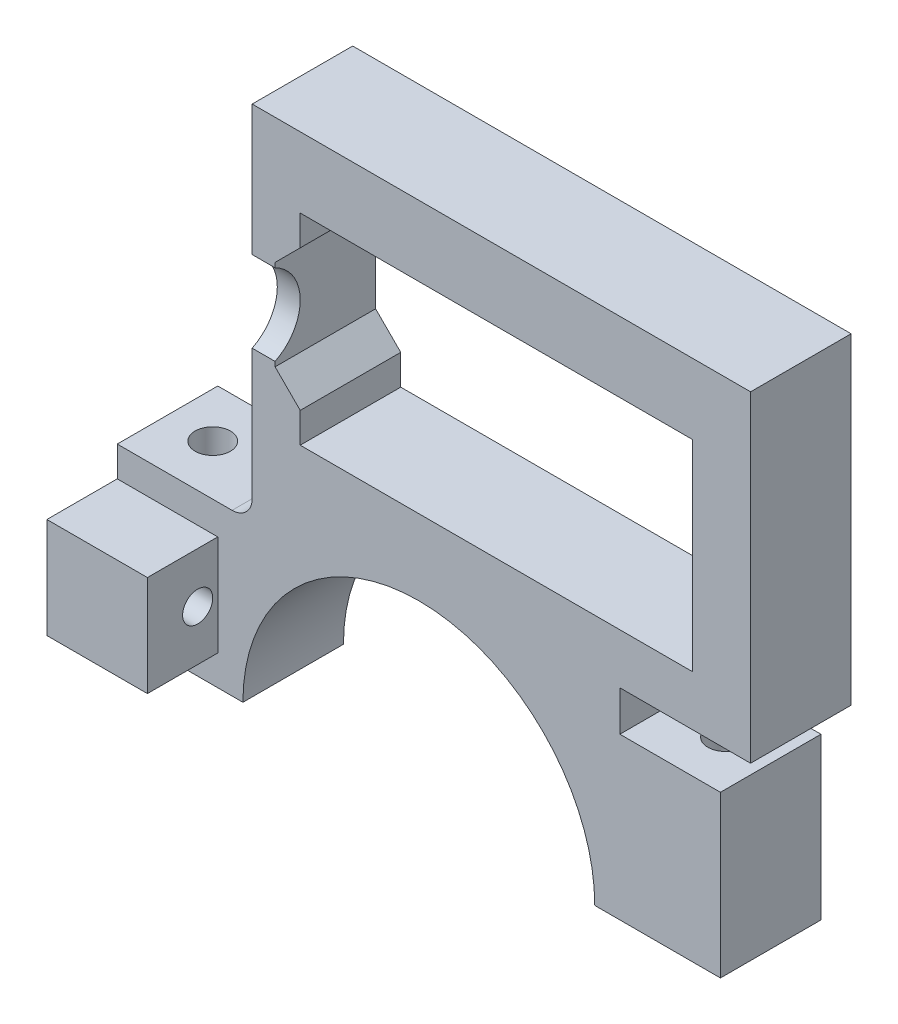
ISO-10303-21;
HEADER;
FILE_DESCRIPTION(('STEP AP214'),'2;1');
FILE_NAME('part.step','',(''),(''),'','','');
FILE_SCHEMA(('AUTOMOTIVE_DESIGN { 1 0 10303 214 1 1 1 1 }'));
ENDSEC;
DATA;
#1=APPLICATION_CONTEXT('core data for automotive mechanical design processes');
#2=APPLICATION_PROTOCOL_DEFINITION('international standard','automotive_design',2000,#1);
#3=PRODUCT_CONTEXT('',#1,'mechanical');
#4=PRODUCT('Part','Part','',(#3));
#5=PRODUCT_RELATED_PRODUCT_CATEGORY('part','',(#4));
#6=PRODUCT_DEFINITION_FORMATION('','',#4);
#7=PRODUCT_DEFINITION_CONTEXT('part definition',#1,'design');
#8=PRODUCT_DEFINITION('design','',#6,#7);
#9=PRODUCT_DEFINITION_SHAPE('','',#8);
#10=(LENGTH_UNIT() NAMED_UNIT(*) SI_UNIT(.MILLI.,.METRE.));
#11=(NAMED_UNIT(*) PLANE_ANGLE_UNIT() SI_UNIT($,.RADIAN.));
#12=(NAMED_UNIT(*) SI_UNIT($,.STERADIAN.) SOLID_ANGLE_UNIT());
#13=UNCERTAINTY_MEASURE_WITH_UNIT(LENGTH_MEASURE(1.E-05),#10,'distance_accuracy_value','');
#14=(GEOMETRIC_REPRESENTATION_CONTEXT(3) GLOBAL_UNCERTAINTY_ASSIGNED_CONTEXT((#13)) GLOBAL_UNIT_ASSIGNED_CONTEXT((#10,
#11,#12)) REPRESENTATION_CONTEXT('',''));
#15=CARTESIAN_POINT('',(0.,0.,0.));
#16=DIRECTION('',(0.,0.,1.));
#17=DIRECTION('',(1.,0.,0.));
#18=AXIS2_PLACEMENT_3D('',#15,#16,#17);
#19=CARTESIAN_POINT('',(30.,0.,10.));
#20=DIRECTION('',(-1.,0.,0.));
#21=DIRECTION('',(0.,0.,1.));
#22=AXIS2_PLACEMENT_3D('',#19,#20,#21);
#23=PLANE('',#22);
#24=DIRECTION('',(0.,1.,0.));
#25=VECTOR('',#24,1.);
#26=CARTESIAN_POINT('',(30.,0.,0.));
#27=LINE('',#26,#25);
#28=CARTESIAN_POINT('',(30.,0.,0.));
#29=VERTEX_POINT('',#28);
#30=CARTESIAN_POINT('',(30.,16.,0.));
#31=VERTEX_POINT('',#30);
#32=EDGE_CURVE('E417',#29,#31,#27,.T.);
#33=ORIENTED_EDGE('',*,*,#32,.T.);
#34=DIRECTION('',(0.,0.,1.));
#35=VECTOR('',#34,1.);
#36=CARTESIAN_POINT('',(30.,16.,-0.000999999999999265));
#37=LINE('',#36,#35);
#38=CARTESIAN_POINT('',(30.,16.,10.));
#39=VERTEX_POINT('',#38);
#40=EDGE_CURVE('E410',#31,#39,#37,.T.);
#41=ORIENTED_EDGE('',*,*,#40,.T.);
#42=DIRECTION('',(0.,1.,0.));
#43=VECTOR('',#42,1.);
#44=CARTESIAN_POINT('',(30.,0.,10.));
#45=LINE('',#44,#43);
#46=CARTESIAN_POINT('',(30.,0.,10.));
#47=VERTEX_POINT('',#46);
#48=EDGE_CURVE('E418',#47,#39,#45,.T.);
#49=ORIENTED_EDGE('',*,*,#48,.F.);
#50=DIRECTION('',(0.,0.,-1.));
#51=VECTOR('',#50,1.);
#52=CARTESIAN_POINT('',(30.,0.,10.));
#53=LINE('',#52,#51);
#54=EDGE_CURVE('E440',#47,#29,#53,.T.);
#55=ORIENTED_EDGE('',*,*,#54,.T.);
#56=EDGE_LOOP('',(#33,#41,#49,#55));
#57=FACE_BOUND('',#56,.T.);
#58=ADVANCED_FACE('F33',(#57),#23,.F.);
#59=CARTESIAN_POINT('',(-30.,52.,10.));
#60=DIRECTION('',(0.,-1.,0.));
#61=DIRECTION('',(0.,0.,-1.));
#62=AXIS2_PLACEMENT_3D('',#59,#60,#61);
#63=PLANE('',#62);
#64=DIRECTION('',(-1.,0.,0.));
#65=VECTOR('',#64,1.);
#66=CARTESIAN_POINT('',(-30.,52.,0.));
#67=LINE('',#66,#65);
#68=CARTESIAN_POINT('',(33.,52.,0.));
#69=VERTEX_POINT('',#68);
#70=CARTESIAN_POINT('',(-16.5792513778195,52.,0.));
#71=VERTEX_POINT('',#70);
#72=EDGE_CURVE('E451',#69,#71,#67,.T.);
#73=ORIENTED_EDGE('',*,*,#72,.T.);
#74=DIRECTION('',(0.,0.,1.));
#75=VECTOR('',#74,1.);
#76=CARTESIAN_POINT('',(-16.5792513778195,52.,-0.000999999999999265));
#77=LINE('',#76,#75);
#78=CARTESIAN_POINT('',(-16.5792513778195,52.,10.));
#79=VERTEX_POINT('',#78);
#80=EDGE_CURVE('E330',#71,#79,#77,.T.);
#81=ORIENTED_EDGE('',*,*,#80,.T.);
#82=DIRECTION('',(-1.,0.,0.));
#83=VECTOR('',#82,1.);
#84=CARTESIAN_POINT('',(-30.,52.,10.));
#85=LINE('',#84,#83);
#86=CARTESIAN_POINT('',(33.,52.,10.));
#87=VERTEX_POINT('',#86);
#88=EDGE_CURVE('E421',#87,#79,#85,.T.);
#89=ORIENTED_EDGE('',*,*,#88,.F.);
#90=DIRECTION('',(0.,0.,1.));
#91=VECTOR('',#90,1.);
#92=CARTESIAN_POINT('',(33.,52.,10.));
#93=LINE('',#92,#91);
#94=EDGE_CURVE('E241',#69,#87,#93,.T.);
#95=ORIENTED_EDGE('',*,*,#94,.F.);
#96=EDGE_LOOP('',(#73,#81,#89,#95));
#97=FACE_BOUND('',#96,.T.);
#98=ADVANCED_FACE('F498',(#97),#63,.F.);
#99=CARTESIAN_POINT('',(-30.,0.,10.));
#100=DIRECTION('',(1.,0.,0.));
#101=DIRECTION('',(0.,0.,-1.));
#102=AXIS2_PLACEMENT_3D('',#99,#100,#101);
#103=PLANE('',#102);
#104=CARTESIAN_POINT('',(-30.,8.,12.));
#105=DIRECTION('',(-1.,0.,0.));
#106=DIRECTION('',(0.,0.,1.));
#107=AXIS2_PLACEMENT_3D('',#104,#105,#106);
#108=CIRCLE('',#107,1.5);
#109=CARTESIAN_POINT('',(-30.,8.,13.5));
#110=VERTEX_POINT('',#109);
#111=EDGE_CURVE('E333',#110,#110,#108,.T.);
#112=ORIENTED_EDGE('',*,*,#111,.F.);
#113=EDGE_LOOP('',(#112));
#114=FACE_BOUND('',#113,.T.);
#115=DIRECTION('',(0.,-1.,0.));
#116=VECTOR('',#115,1.);
#117=CARTESIAN_POINT('',(-30.,0.,10.));
#118=LINE('',#117,#116);
#119=CARTESIAN_POINT('',(-30.,16.,10.));
#120=VERTEX_POINT('',#119);
#121=CARTESIAN_POINT('',(-30.,13.,10.));
#122=VERTEX_POINT('',#121);
#123=EDGE_CURVE('E433',#120,#122,#118,.T.);
#124=ORIENTED_EDGE('',*,*,#123,.F.);
#125=DIRECTION('',(0.,0.,1.));
#126=VECTOR('',#125,1.);
#127=CARTESIAN_POINT('',(-30.,16.,-0.000999999999999265));
#128=LINE('',#127,#126);
#129=CARTESIAN_POINT('',(-30.,16.,0.));
#130=VERTEX_POINT('',#129);
#131=EDGE_CURVE('E398',#130,#120,#128,.T.);
#132=ORIENTED_EDGE('',*,*,#131,.F.);
#133=DIRECTION('',(0.,-1.,0.));
#134=VECTOR('',#133,1.);
#135=CARTESIAN_POINT('',(-30.,0.,0.));
#136=LINE('',#135,#134);
#137=CARTESIAN_POINT('',(-30.,0.,0.));
#138=VERTEX_POINT('',#137);
#139=EDGE_CURVE('E449',#130,#138,#136,.T.);
#140=ORIENTED_EDGE('',*,*,#139,.T.);
#141=DIRECTION('',(0.,0.,-1.));
#142=VECTOR('',#141,1.);
#143=CARTESIAN_POINT('',(-30.,0.,10.));
#144=LINE('',#143,#142);
#145=CARTESIAN_POINT('',(-30.,0.,10.));
#146=VERTEX_POINT('',#145);
#147=EDGE_CURVE('E11',#146,#138,#144,.T.);
#148=ORIENTED_EDGE('',*,*,#147,.F.);
#149=CARTESIAN_POINT('',(-30.,3.,10.));
#150=VERTEX_POINT('',#149);
#151=EDGE_CURVE('E424',#150,#146,#118,.T.);
#152=ORIENTED_EDGE('',*,*,#151,.F.);
#153=DIRECTION('',(0.,0.,-1.));
#154=VECTOR('',#153,1.);
#155=CARTESIAN_POINT('',(-30.,3.,17.));
#156=LINE('',#155,#154);
#157=CARTESIAN_POINT('',(-30.,3.,17.));
#158=VERTEX_POINT('',#157);
#159=EDGE_CURVE('E378',#158,#150,#156,.T.);
#160=ORIENTED_EDGE('',*,*,#159,.F.);
#161=DIRECTION('',(0.,-1.,0.));
#162=VECTOR('',#161,1.);
#163=CARTESIAN_POINT('',(-30.,3.,17.));
#164=LINE('',#163,#162);
#165=CARTESIAN_POINT('',(-30.,13.,17.));
#166=VERTEX_POINT('',#165);
#167=EDGE_CURVE('E344',#166,#158,#164,.T.);
#168=ORIENTED_EDGE('',*,*,#167,.F.);
#169=DIRECTION('',(0.,0.,-1.));
#170=VECTOR('',#169,1.);
#171=CARTESIAN_POINT('',(-30.,13.,17.));
#172=LINE('',#171,#170);
#173=EDGE_CURVE('E354',#166,#122,#172,.T.);
#174=ORIENTED_EDGE('',*,*,#173,.T.);
#175=EDGE_LOOP('',(#124,#132,#140,#148,#152,#160,#168,#174));
#176=FACE_BOUND('',#175,.T.);
#177=ADVANCED_FACE('F503',(#114,#176),#103,.F.);
#178=CARTESIAN_POINT('',(-30.,0.,10.));
#179=DIRECTION('',(0.,1.,0.));
#180=DIRECTION('',(0.,0.,1.));
#181=AXIS2_PLACEMENT_3D('',#178,#179,#180);
#182=PLANE('',#181);
#183=CARTESIAN_POINT('',(-25.5,0.,5.));
#184=DIRECTION('',(0.,1.,0.));
#185=DIRECTION('',(0.,0.,1.));
#186=AXIS2_PLACEMENT_3D('',#183,#184,#185);
#187=CIRCLE('',#186,1.75);
#188=CARTESIAN_POINT('',(-25.5,0.,6.75));
#189=VERTEX_POINT('',#188);
#190=EDGE_CURVE('E393',#189,#189,#187,.F.);
#191=ORIENTED_EDGE('',*,*,#190,.F.);
#192=EDGE_LOOP('',(#191));
#193=FACE_BOUND('',#192,.T.);
#194=DIRECTION('',(1.,0.,0.));
#195=VECTOR('',#194,1.);
#196=CARTESIAN_POINT('',(-30.,0.,0.));
#197=LINE('',#196,#195);
#198=CARTESIAN_POINT('',(-17.5,0.,0.));
#199=VERTEX_POINT('',#198);
#200=EDGE_CURVE('E447',#138,#199,#197,.T.);
#201=ORIENTED_EDGE('',*,*,#200,.T.);
#202=DIRECTION('',(0.,0.,-1.));
#203=VECTOR('',#202,1.);
#204=CARTESIAN_POINT('',(-17.5,0.,10.));
#205=LINE('',#204,#203);
#206=CARTESIAN_POINT('',(-17.5,0.,10.));
#207=VERTEX_POINT('',#206);
#208=EDGE_CURVE('E41',#207,#199,#205,.T.);
#209=ORIENTED_EDGE('',*,*,#208,.F.);
#210=DIRECTION('',(1.,0.,0.));
#211=VECTOR('',#210,1.);
#212=CARTESIAN_POINT('',(-30.,0.,10.));
#213=LINE('',#212,#211);
#214=EDGE_CURVE('E427',#146,#207,#213,.T.);
#215=ORIENTED_EDGE('',*,*,#214,.F.);
#216=ORIENTED_EDGE('',*,*,#147,.T.);
#217=EDGE_LOOP('',(#201,#209,#215,#216));
#218=FACE_BOUND('',#217,.T.);
#219=ADVANCED_FACE('F464',(#193,#218),#182,.F.);
#220=CARTESIAN_POINT('',(0.,0.,10.));
#221=DIRECTION('',(0.,0.,-1.));
#222=DIRECTION('',(-1.,0.,0.));
#223=AXIS2_PLACEMENT_3D('',#220,#221,#222);
#224=CYLINDRICAL_SURFACE('',#223,17.5);
#225=CARTESIAN_POINT('',(0.,0.,0.));
#226=DIRECTION('',(0.,0.,-1.));
#227=DIRECTION('',(1.,0.,0.));
#228=AXIS2_PLACEMENT_3D('',#225,#226,#227);
#229=CIRCLE('',#228,17.5);
#230=CARTESIAN_POINT('',(17.5,0.,0.));
#231=VERTEX_POINT('',#230);
#232=EDGE_CURVE('E445',#199,#231,#229,.T.);
#233=ORIENTED_EDGE('',*,*,#232,.T.);
#234=DIRECTION('',(0.,0.,-1.));
#235=VECTOR('',#234,1.);
#236=CARTESIAN_POINT('',(17.5,0.,10.));
#237=LINE('',#236,#235);
#238=CARTESIAN_POINT('',(17.5,0.,10.));
#239=VERTEX_POINT('',#238);
#240=EDGE_CURVE('E437',#239,#231,#237,.T.);
#241=ORIENTED_EDGE('',*,*,#240,.F.);
#242=CARTESIAN_POINT('',(0.,0.,10.));
#243=DIRECTION('',(0.,0.,-1.));
#244=DIRECTION('',(1.,0.,0.));
#245=AXIS2_PLACEMENT_3D('',#242,#243,#244);
#246=CIRCLE('',#245,17.5);
#247=EDGE_CURVE('E456',#207,#239,#246,.T.);
#248=ORIENTED_EDGE('',*,*,#247,.F.);
#249=ORIENTED_EDGE('',*,*,#208,.T.);
#250=EDGE_LOOP('',(#233,#241,#248,#249));
#251=FACE_BOUND('',#250,.T.);
#252=ADVANCED_FACE('F468',(#251),#224,.F.);
#253=CARTESIAN_POINT('',(17.5,0.,10.));
#254=DIRECTION('',(0.,1.,0.));
#255=DIRECTION('',(0.,0.,1.));
#256=AXIS2_PLACEMENT_3D('',#253,#254,#255);
#257=PLANE('',#256);
#258=CARTESIAN_POINT('',(25.5,0.,5.));
#259=DIRECTION('',(0.,1.,0.));
#260=DIRECTION('',(0.,0.,1.));
#261=AXIS2_PLACEMENT_3D('',#258,#259,#260);
#262=CIRCLE('',#261,1.75);
#263=CARTESIAN_POINT('',(25.5,0.,6.75));
#264=VERTEX_POINT('',#263);
#265=EDGE_CURVE('E387',#264,#264,#262,.F.);
#266=ORIENTED_EDGE('',*,*,#265,.F.);
#267=EDGE_LOOP('',(#266));
#268=FACE_BOUND('',#267,.T.);
#269=DIRECTION('',(1.,0.,0.));
#270=VECTOR('',#269,1.);
#271=CARTESIAN_POINT('',(17.5,0.,0.));
#272=LINE('',#271,#270);
#273=EDGE_CURVE('E422',#231,#29,#272,.T.);
#274=ORIENTED_EDGE('',*,*,#273,.T.);
#275=ORIENTED_EDGE('',*,*,#54,.F.);
#276=DIRECTION('',(1.,0.,0.));
#277=VECTOR('',#276,1.);
#278=CARTESIAN_POINT('',(17.5,0.,10.));
#279=LINE('',#278,#277);
#280=EDGE_CURVE('E443',#239,#47,#279,.T.);
#281=ORIENTED_EDGE('',*,*,#280,.F.);
#282=ORIENTED_EDGE('',*,*,#240,.T.);
#283=EDGE_LOOP('',(#274,#275,#281,#282));
#284=FACE_BOUND('',#283,.T.);
#285=ADVANCED_FACE('F473',(#268,#284),#257,.F.);
#286=CARTESIAN_POINT('',(0.,0.,10.));
#287=DIRECTION('',(0.,0.,1.));
#288=DIRECTION('',(1.,0.,0.));
#289=AXIS2_PLACEMENT_3D('',#286,#287,#288);
#290=PLANE('',#289);
#291=DIRECTION('',(-1.,0.,0.));
#292=VECTOR('',#291,1.);
#293=CARTESIAN_POINT('',(30.001,39.0311288741493,10.));
#294=LINE('',#293,#292);
#295=CARTESIAN_POINT('',(-16.5792513778195,39.0311288741493,10.));
#296=VERTEX_POINT('',#295);
#297=CARTESIAN_POINT('',(-14.3000000000003,39.0311288741493,10.));
#298=VERTEX_POINT('',#297);
#299=EDGE_CURVE('E247',#296,#298,#294,.F.);
#300=ORIENTED_EDGE('',*,*,#299,.T.);
#301=DIRECTION('',(0.,-1.,0.));
#302=VECTOR('',#301,1.);
#303=CARTESIAN_POINT('',(-14.3000000000003,39.5,10.));
#304=LINE('',#303,#302);
#305=CARTESIAN_POINT('',(-14.3000000000003,39.5,10.));
#306=VERTEX_POINT('',#305);
#307=EDGE_CURVE('E284',#306,#298,#304,.T.);
#308=ORIENTED_EDGE('',*,*,#307,.F.);
#309=DIRECTION('',(-0.707106781186546,-0.707106781186549,0.));
#310=VECTOR('',#309,1.);
#311=CARTESIAN_POINT('',(-11.8000000000003,42.,10.));
#312=LINE('',#311,#310);
#313=CARTESIAN_POINT('',(-11.8000000000003,42.,10.));
#314=VERTEX_POINT('',#313);
#315=EDGE_CURVE('E280',#314,#306,#312,.T.);
#316=ORIENTED_EDGE('',*,*,#315,.F.);
#317=DIRECTION('',(0.,-1.,0.));
#318=VECTOR('',#317,1.);
#319=CARTESIAN_POINT('',(-11.8000000000003,45.,10.));
#320=LINE('',#319,#318);
#321=CARTESIAN_POINT('',(-11.8000000000003,45.,10.));
#322=VERTEX_POINT('',#321);
#323=EDGE_CURVE('E277',#322,#314,#320,.T.);
#324=ORIENTED_EDGE('',*,*,#323,.F.);
#325=DIRECTION('',(-1.,0.,0.));
#326=VECTOR('',#325,1.);
#327=CARTESIAN_POINT('',(27.1999999999997,45.,10.));
#328=LINE('',#327,#326);
#329=CARTESIAN_POINT('',(27.1999999999997,45.,10.));
#330=VERTEX_POINT('',#329);
#331=EDGE_CURVE('E274',#330,#322,#328,.T.);
#332=ORIENTED_EDGE('',*,*,#331,.F.);
#333=DIRECTION('',(0.,1.,0.));
#334=VECTOR('',#333,1.);
#335=CARTESIAN_POINT('',(27.1999999999997,45.,10.));
#336=LINE('',#335,#334);
#337=CARTESIAN_POINT('',(27.1999999999997,25.0000000000061,10.));
#338=VERTEX_POINT('',#337);
#339=EDGE_CURVE('E57',#338,#330,#336,.T.);
#340=ORIENTED_EDGE('',*,*,#339,.F.);
#341=DIRECTION('',(1.,0.,0.));
#342=VECTOR('',#341,1.);
#343=CARTESIAN_POINT('',(27.1999999999997,25.0000000000061,10.));
#344=LINE('',#343,#342);
#345=CARTESIAN_POINT('',(-11.8000000000003,25.0000000000061,10.));
#346=VERTEX_POINT('',#345);
#347=EDGE_CURVE('E293',#346,#338,#344,.T.);
#348=ORIENTED_EDGE('',*,*,#347,.F.);
#349=DIRECTION('',(0.,-1.,0.));
#350=VECTOR('',#349,1.);
#351=CARTESIAN_POINT('',(-11.8000000000003,28.0000000000061,10.));
#352=LINE('',#351,#350);
#353=CARTESIAN_POINT('',(-11.8000000000003,28.0000000000061,10.));
#354=VERTEX_POINT('',#353);
#355=EDGE_CURVE('E290',#354,#346,#352,.T.);
#356=ORIENTED_EDGE('',*,*,#355,.F.);
#357=DIRECTION('',(0.707106781186549,-0.707106781186546,0.));
#358=VECTOR('',#357,1.);
#359=CARTESIAN_POINT('',(-14.3000000000003,30.5000000000061,10.));
#360=LINE('',#359,#358);
#361=CARTESIAN_POINT('',(-14.3000000000003,30.5000000000061,10.));
#362=VERTEX_POINT('',#361);
#363=EDGE_CURVE('E287',#362,#354,#360,.T.);
#364=ORIENTED_EDGE('',*,*,#363,.F.);
#365=CARTESIAN_POINT('',(-14.3000000000003,30.9688711258507,10.));
#366=VERTEX_POINT('',#365);
#367=EDGE_CURVE('E283',#366,#362,#304,.T.);
#368=ORIENTED_EDGE('',*,*,#367,.F.);
#369=DIRECTION('',(-1.,0.,0.));
#370=VECTOR('',#369,1.);
#371=CARTESIAN_POINT('',(30.001,30.9688711258507,10.));
#372=LINE('',#371,#370);
#373=CARTESIAN_POINT('',(-16.5792513778195,30.9688711258507,10.));
#374=VERTEX_POINT('',#373);
#375=EDGE_CURVE('E49',#366,#374,#372,.T.);
#376=ORIENTED_EDGE('',*,*,#375,.T.);
#377=DIRECTION('',(0.,1.,0.));
#378=VECTOR('',#377,1.);
#379=CARTESIAN_POINT('',(-16.5792513778195,52.,10.));
#380=LINE('',#379,#378);
#381=CARTESIAN_POINT('',(-16.5792513778195,18.,10.));
#382=VERTEX_POINT('',#381);
#383=EDGE_CURVE('E326',#382,#374,#380,.T.);
#384=ORIENTED_EDGE('',*,*,#383,.F.);
#385=CARTESIAN_POINT('',(-18.5792513778195,18.,10.));
#386=DIRECTION('',(0.,0.,1.));
#387=DIRECTION('',(-1.,0.,0.));
#388=AXIS2_PLACEMENT_3D('',#385,#386,#387);
#389=CIRCLE('',#388,2.);
#390=CARTESIAN_POINT('',(-18.5792513778195,16.,10.));
#391=VERTEX_POINT('',#390);
#392=EDGE_CURVE('E322',#391,#382,#389,.T.);
#393=ORIENTED_EDGE('',*,*,#392,.F.);
#394=DIRECTION('',(1.,0.,0.));
#395=VECTOR('',#394,1.);
#396=CARTESIAN_POINT('',(-30.,16.,10.));
#397=LINE('',#396,#395);
#398=EDGE_CURVE('E396',#120,#391,#397,.T.);
#399=ORIENTED_EDGE('',*,*,#398,.F.);
#400=ORIENTED_EDGE('',*,*,#123,.T.);
#401=DIRECTION('',(-1.,0.,0.));
#402=VECTOR('',#401,1.);
#403=CARTESIAN_POINT('',(-30.,13.,10.));
#404=LINE('',#403,#402);
#405=CARTESIAN_POINT('',(-20.,13.,10.));
#406=VERTEX_POINT('',#405);
#407=EDGE_CURVE('E348',#406,#122,#404,.T.);
#408=ORIENTED_EDGE('',*,*,#407,.F.);
#409=DIRECTION('',(0.,1.,0.));
#410=VECTOR('',#409,1.);
#411=CARTESIAN_POINT('',(-20.,3.,10.));
#412=LINE('',#411,#410);
#413=CARTESIAN_POINT('',(-20.,3.,10.));
#414=VERTEX_POINT('',#413);
#415=EDGE_CURVE('E355',#414,#406,#412,.T.);
#416=ORIENTED_EDGE('',*,*,#415,.F.);
#417=DIRECTION('',(1.,0.,0.));
#418=VECTOR('',#417,1.);
#419=CARTESIAN_POINT('',(-30.,3.,10.));
#420=LINE('',#419,#418);
#421=EDGE_CURVE('E343',#150,#414,#420,.T.);
#422=ORIENTED_EDGE('',*,*,#421,.F.);
#423=ORIENTED_EDGE('',*,*,#151,.T.);
#424=ORIENTED_EDGE('',*,*,#214,.T.);
#425=ORIENTED_EDGE('',*,*,#247,.T.);
#426=ORIENTED_EDGE('',*,*,#280,.T.);
#427=ORIENTED_EDGE('',*,*,#48,.T.);
#428=DIRECTION('',(1.,0.,0.));
#429=VECTOR('',#428,1.);
#430=CARTESIAN_POINT('',(30.,16.,10.));
#431=LINE('',#430,#429);
#432=CARTESIAN_POINT('',(20.,16.,10.));
#433=VERTEX_POINT('',#432);
#434=EDGE_CURVE('E407',#433,#39,#431,.T.);
#435=ORIENTED_EDGE('',*,*,#434,.F.);
#436=DIRECTION('',(0.,-1.,0.));
#437=VECTOR('',#436,1.);
#438=CARTESIAN_POINT('',(20.,16.,10.));
#439=LINE('',#438,#437);
#440=CARTESIAN_POINT('',(20.,20.,10.));
#441=VERTEX_POINT('',#440);
#442=EDGE_CURVE('E223',#441,#433,#439,.T.);
#443=ORIENTED_EDGE('',*,*,#442,.F.);
#444=DIRECTION('',(-1.,0.,0.));
#445=VECTOR('',#444,1.);
#446=CARTESIAN_POINT('',(20.,20.,10.));
#447=LINE('',#446,#445);
#448=CARTESIAN_POINT('',(33.,20.,10.));
#449=VERTEX_POINT('',#448);
#450=EDGE_CURVE('E214',#449,#441,#447,.T.);
#451=ORIENTED_EDGE('',*,*,#450,.F.);
#452=DIRECTION('',(0.,-1.,0.));
#453=VECTOR('',#452,1.);
#454=CARTESIAN_POINT('',(33.,52.,10.));
#455=LINE('',#454,#453);
#456=EDGE_CURVE('E220',#87,#449,#455,.T.);
#457=ORIENTED_EDGE('',*,*,#456,.F.);
#458=ORIENTED_EDGE('',*,*,#88,.T.);
#459=EDGE_CURVE('E325',#296,#79,#380,.T.);
#460=ORIENTED_EDGE('',*,*,#459,.F.);
#461=EDGE_LOOP('',(#300,#308,#316,#324,#332,#340,#348,#356,#364,#368,#376,#384,#393,#399,#400,
#408,#416,#422,#423,#424,#425,#426,#427,#435,#443,#451,#457,#458,#460));
#462=FACE_BOUND('',#461,.T.);
#463=ADVANCED_FACE('F217',(#462),#290,.T.);
#464=CARTESIAN_POINT('',(0.,0.,0.));
#465=DIRECTION('',(0.,0.,1.));
#466=DIRECTION('',(1.,0.,0.));
#467=AXIS2_PLACEMENT_3D('',#464,#465,#466);
#468=PLANE('',#467);
#469=DIRECTION('',(-1.,0.,0.));
#470=VECTOR('',#469,1.);
#471=CARTESIAN_POINT('',(27.1999999999997,25.0000000000061,0.));
#472=LINE('',#471,#470);
#473=CARTESIAN_POINT('',(27.1999999999997,25.0000000000061,0.));
#474=VERTEX_POINT('',#473);
#475=CARTESIAN_POINT('',(-11.8000000000003,25.0000000000061,0.));
#476=VERTEX_POINT('',#475);
#477=EDGE_CURVE('E267',#474,#476,#472,.T.);
#478=ORIENTED_EDGE('',*,*,#477,.F.);
#479=DIRECTION('',(0.,-1.,0.));
#480=VECTOR('',#479,1.);
#481=CARTESIAN_POINT('',(27.1999999999997,45.,0.));
#482=LINE('',#481,#480);
#483=CARTESIAN_POINT('',(27.1999999999997,45.,0.));
#484=VERTEX_POINT('',#483);
#485=EDGE_CURVE('E270',#484,#474,#482,.T.);
#486=ORIENTED_EDGE('',*,*,#485,.F.);
#487=DIRECTION('',(1.,0.,0.));
#488=VECTOR('',#487,1.);
#489=CARTESIAN_POINT('',(27.1999999999997,45.,0.));
#490=LINE('',#489,#488);
#491=CARTESIAN_POINT('',(-11.8000000000003,45.,0.));
#492=VERTEX_POINT('',#491);
#493=EDGE_CURVE('E299',#492,#484,#490,.T.);
#494=ORIENTED_EDGE('',*,*,#493,.F.);
#495=DIRECTION('',(0.,1.,0.));
#496=VECTOR('',#495,1.);
#497=CARTESIAN_POINT('',(-11.8000000000003,45.,0.));
#498=LINE('',#497,#496);
#499=CARTESIAN_POINT('',(-11.8000000000003,42.,0.));
#500=VERTEX_POINT('',#499);
#501=EDGE_CURVE('E253',#500,#492,#498,.T.);
#502=ORIENTED_EDGE('',*,*,#501,.F.);
#503=DIRECTION('',(0.707106781186546,0.707106781186549,0.));
#504=VECTOR('',#503,1.);
#505=CARTESIAN_POINT('',(-11.8000000000003,42.,0.));
#506=LINE('',#505,#504);
#507=CARTESIAN_POINT('',(-14.3000000000003,39.5,0.));
#508=VERTEX_POINT('',#507);
#509=EDGE_CURVE('E255',#508,#500,#506,.T.);
#510=ORIENTED_EDGE('',*,*,#509,.F.);
#511=DIRECTION('',(0.,1.,0.));
#512=VECTOR('',#511,1.);
#513=CARTESIAN_POINT('',(-14.3000000000003,39.5,0.));
#514=LINE('',#513,#512);
#515=CARTESIAN_POINT('',(-14.3000000000003,30.5000000000061,0.));
#516=VERTEX_POINT('',#515);
#517=EDGE_CURVE('E258',#516,#508,#514,.T.);
#518=ORIENTED_EDGE('',*,*,#517,.F.);
#519=DIRECTION('',(-0.707106781186549,0.707106781186546,0.));
#520=VECTOR('',#519,1.);
#521=CARTESIAN_POINT('',(-14.3000000000003,30.5000000000061,0.));
#522=LINE('',#521,#520);
#523=CARTESIAN_POINT('',(-11.8000000000003,28.0000000000061,0.));
#524=VERTEX_POINT('',#523);
#525=EDGE_CURVE('E261',#524,#516,#522,.T.);
#526=ORIENTED_EDGE('',*,*,#525,.F.);
#527=DIRECTION('',(0.,1.,0.));
#528=VECTOR('',#527,1.);
#529=CARTESIAN_POINT('',(-11.8000000000003,28.0000000000061,0.));
#530=LINE('',#529,#528);
#531=EDGE_CURVE('E264',#476,#524,#530,.T.);
#532=ORIENTED_EDGE('',*,*,#531,.F.);
#533=EDGE_LOOP('',(#478,#486,#494,#502,#510,#518,#526,#532));
#534=FACE_BOUND('',#533,.T.);
#535=CARTESIAN_POINT('',(-18.5792513778195,18.,0.));
#536=DIRECTION('',(0.,0.,1.));
#537=DIRECTION('',(1.,0.,0.));
#538=AXIS2_PLACEMENT_3D('',#535,#536,#537);
#539=CIRCLE('',#538,2.);
#540=CARTESIAN_POINT('',(-16.5792513778195,18.,0.));
#541=VERTEX_POINT('',#540);
#542=CARTESIAN_POINT('',(-18.5792513778195,16.,0.));
#543=VERTEX_POINT('',#542);
#544=EDGE_CURVE('E316',#541,#543,#539,.F.);
#545=ORIENTED_EDGE('',*,*,#544,.F.);
#546=DIRECTION('',(0.,-1.,0.));
#547=VECTOR('',#546,1.);
#548=CARTESIAN_POINT('',(-16.5792513778195,52.,0.));
#549=LINE('',#548,#547);
#550=EDGE_CURVE('E319',#71,#541,#549,.T.);
#551=ORIENTED_EDGE('',*,*,#550,.F.);
#552=ORIENTED_EDGE('',*,*,#72,.F.);
#553=DIRECTION('',(0.,1.,0.));
#554=VECTOR('',#553,1.);
#555=CARTESIAN_POINT('',(33.,52.,0.));
#556=LINE('',#555,#554);
#557=CARTESIAN_POINT('',(33.,20.,0.));
#558=VERTEX_POINT('',#557);
#559=EDGE_CURVE('E236',#558,#69,#556,.T.);
#560=ORIENTED_EDGE('',*,*,#559,.F.);
#561=DIRECTION('',(1.,0.,0.));
#562=VECTOR('',#561,1.);
#563=CARTESIAN_POINT('',(20.,20.,0.));
#564=LINE('',#563,#562);
#565=CARTESIAN_POINT('',(20.,20.,0.));
#566=VERTEX_POINT('',#565);
#567=EDGE_CURVE('E232',#566,#558,#564,.T.);
#568=ORIENTED_EDGE('',*,*,#567,.F.);
#569=DIRECTION('',(0.,1.,0.));
#570=VECTOR('',#569,1.);
#571=CARTESIAN_POINT('',(20.,16.,0.));
#572=LINE('',#571,#570);
#573=CARTESIAN_POINT('',(20.,16.,0.));
#574=VERTEX_POINT('',#573);
#575=EDGE_CURVE('E402',#574,#566,#572,.T.);
#576=ORIENTED_EDGE('',*,*,#575,.F.);
#577=DIRECTION('',(-1.,0.,0.));
#578=VECTOR('',#577,1.);
#579=CARTESIAN_POINT('',(30.,16.,0.));
#580=LINE('',#579,#578);
#581=EDGE_CURVE('E226',#31,#574,#580,.T.);
#582=ORIENTED_EDGE('',*,*,#581,.F.);
#583=ORIENTED_EDGE('',*,*,#32,.F.);
#584=ORIENTED_EDGE('',*,*,#273,.F.);
#585=ORIENTED_EDGE('',*,*,#232,.F.);
#586=ORIENTED_EDGE('',*,*,#200,.F.);
#587=ORIENTED_EDGE('',*,*,#139,.F.);
#588=DIRECTION('',(-1.,0.,0.));
#589=VECTOR('',#588,1.);
#590=CARTESIAN_POINT('',(-30.,16.,0.));
#591=LINE('',#590,#589);
#592=EDGE_CURVE('E400',#543,#130,#591,.T.);
#593=ORIENTED_EDGE('',*,*,#592,.F.);
#594=EDGE_LOOP('',(#545,#551,#552,#560,#568,#576,#582,#583,#584,#585,#586,#587,#593));
#595=FACE_BOUND('',#594,.T.);
#596=ADVANCED_FACE('F483',(#534,#595),#468,.F.);
#597=CARTESIAN_POINT('',(30.,16.,-0.000999999999999265));
#598=DIRECTION('',(0.,-1.,0.));
#599=DIRECTION('',(1.,0.,0.));
#600=AXIS2_PLACEMENT_3D('',#597,#598,#599);
#601=PLANE('',#600);
#602=CARTESIAN_POINT('',(25.5,16.,5.));
#603=DIRECTION('',(0.,1.,0.));
#604=DIRECTION('',(-1.,0.,0.));
#605=AXIS2_PLACEMENT_3D('',#602,#603,#604);
#606=CIRCLE('',#605,1.75);
#607=CARTESIAN_POINT('',(23.75,16.,5.));
#608=VERTEX_POINT('',#607);
#609=EDGE_CURVE('E383',#608,#608,#606,.T.);
#610=ORIENTED_EDGE('',*,*,#609,.F.);
#611=EDGE_LOOP('',(#610));
#612=FACE_BOUND('',#611,.T.);
#613=ORIENTED_EDGE('',*,*,#581,.T.);
#614=DIRECTION('',(0.,0.,1.));
#615=VECTOR('',#614,1.);
#616=CARTESIAN_POINT('',(20.,16.,-0.000999999999999265));
#617=LINE('',#616,#615);
#618=EDGE_CURVE('E413',#574,#433,#617,.T.);
#619=ORIENTED_EDGE('',*,*,#618,.T.);
#620=ORIENTED_EDGE('',*,*,#434,.T.);
#621=ORIENTED_EDGE('',*,*,#40,.F.);
#622=EDGE_LOOP('',(#613,#619,#620,#621));
#623=FACE_BOUND('',#622,.T.);
#624=ADVANCED_FACE('F479',(#612,#623),#601,.F.);
#625=CARTESIAN_POINT('',(20.,16.,-0.000999999999999265));
#626=DIRECTION('',(-1.,0.,0.));
#627=DIRECTION('',(0.,-1.,0.));
#628=AXIS2_PLACEMENT_3D('',#625,#626,#627);
#629=PLANE('',#628);
#630=ORIENTED_EDGE('',*,*,#575,.T.);
#631=DIRECTION('',(0.,0.,1.));
#632=VECTOR('',#631,1.);
#633=CARTESIAN_POINT('',(20.,20.,-0.000999999999999265));
#634=LINE('',#633,#632);
#635=EDGE_CURVE('E409',#566,#441,#634,.T.);
#636=ORIENTED_EDGE('',*,*,#635,.T.);
#637=ORIENTED_EDGE('',*,*,#442,.T.);
#638=ORIENTED_EDGE('',*,*,#618,.F.);
#639=EDGE_LOOP('',(#630,#636,#637,#638));
#640=FACE_BOUND('',#639,.T.);
#641=ADVANCED_FACE('F485',(#640),#629,.F.);
#642=CARTESIAN_POINT('',(20.,20.,-0.000999999999999265));
#643=DIRECTION('',(0.,1.,0.));
#644=DIRECTION('',(0.,0.,1.));
#645=AXIS2_PLACEMENT_3D('',#642,#643,#644);
#646=PLANE('',#645);
#647=ORIENTED_EDGE('',*,*,#567,.T.);
#648=DIRECTION('',(0.,0.,-1.));
#649=VECTOR('',#648,1.);
#650=CARTESIAN_POINT('',(33.,20.,10.));
#651=LINE('',#650,#649);
#652=EDGE_CURVE('E229',#449,#558,#651,.T.);
#653=ORIENTED_EDGE('',*,*,#652,.F.);
#654=ORIENTED_EDGE('',*,*,#450,.T.);
#655=ORIENTED_EDGE('',*,*,#635,.F.);
#656=EDGE_LOOP('',(#647,#653,#654,#655));
#657=FACE_BOUND('',#656,.T.);
#658=ADVANCED_FACE('F230',(#657),#646,.F.);
#659=CARTESIAN_POINT('',(-30.,16.,-0.000999999999999265));
#660=DIRECTION('',(0.,-1.,0.));
#661=DIRECTION('',(0.,0.,-1.));
#662=AXIS2_PLACEMENT_3D('',#659,#660,#661);
#663=PLANE('',#662);
#664=CARTESIAN_POINT('',(-25.5,16.,5.));
#665=DIRECTION('',(0.,1.,0.));
#666=DIRECTION('',(-1.,0.,0.));
#667=AXIS2_PLACEMENT_3D('',#664,#665,#666);
#668=CIRCLE('',#667,1.75);
#669=CARTESIAN_POINT('',(-27.25,16.,5.));
#670=VERTEX_POINT('',#669);
#671=EDGE_CURVE('E390',#670,#670,#668,.T.);
#672=ORIENTED_EDGE('',*,*,#671,.F.);
#673=EDGE_LOOP('',(#672));
#674=FACE_BOUND('',#673,.T.);
#675=ORIENTED_EDGE('',*,*,#592,.T.);
#676=ORIENTED_EDGE('',*,*,#131,.T.);
#677=ORIENTED_EDGE('',*,*,#398,.T.);
#678=DIRECTION('',(0.,0.,1.));
#679=VECTOR('',#678,1.);
#680=CARTESIAN_POINT('',(-18.5792513778195,16.,-0.000999999999999265));
#681=LINE('',#680,#679);
#682=EDGE_CURVE('E329',#543,#391,#681,.T.);
#683=ORIENTED_EDGE('',*,*,#682,.F.);
#684=EDGE_LOOP('',(#675,#676,#677,#683));
#685=FACE_BOUND('',#684,.T.);
#686=ADVANCED_FACE('F493',(#674,#685),#663,.F.);
#687=CARTESIAN_POINT('',(-25.5,-0.00100000000000447,5.));
#688=DIRECTION('',(0.,1.,0.));
#689=DIRECTION('',(-1.,0.,0.));
#690=AXIS2_PLACEMENT_3D('',#687,#688,#689);
#691=CYLINDRICAL_SURFACE('',#690,1.75);
#692=ORIENTED_EDGE('',*,*,#671,.T.);
#693=EDGE_LOOP('',(#692));
#694=FACE_BOUND('',#693,.T.);
#695=ORIENTED_EDGE('',*,*,#190,.T.);
#696=EDGE_LOOP('',(#695));
#697=FACE_BOUND('',#696,.T.);
#698=ADVANCED_FACE('F673',(#694,#697),#691,.F.);
#699=CARTESIAN_POINT('',(25.5,-0.00100000000003916,5.));
#700=DIRECTION('',(0.,1.,0.));
#701=DIRECTION('',(-1.,0.,0.));
#702=AXIS2_PLACEMENT_3D('',#699,#700,#701);
#703=CYLINDRICAL_SURFACE('',#702,1.75);
#704=ORIENTED_EDGE('',*,*,#609,.T.);
#705=EDGE_LOOP('',(#704));
#706=FACE_BOUND('',#705,.T.);
#707=ORIENTED_EDGE('',*,*,#265,.T.);
#708=EDGE_LOOP('',(#707));
#709=FACE_BOUND('',#708,.T.);
#710=ADVANCED_FACE('F720',(#706,#709),#703,.F.);
#711=CARTESIAN_POINT('',(-30.,3.,17.));
#712=DIRECTION('',(0.,1.,0.));
#713=DIRECTION('',(0.,0.,1.));
#714=AXIS2_PLACEMENT_3D('',#711,#712,#713);
#715=PLANE('',#714);
#716=ORIENTED_EDGE('',*,*,#421,.T.);
#717=DIRECTION('',(0.,0.,-1.));
#718=VECTOR('',#717,1.);
#719=CARTESIAN_POINT('',(-20.,3.,17.));
#720=LINE('',#719,#718);
#721=CARTESIAN_POINT('',(-20.,3.,17.));
#722=VERTEX_POINT('',#721);
#723=EDGE_CURVE('E373',#722,#414,#720,.T.);
#724=ORIENTED_EDGE('',*,*,#723,.F.);
#725=DIRECTION('',(1.,0.,0.));
#726=VECTOR('',#725,1.);
#727=CARTESIAN_POINT('',(-30.,3.,17.));
#728=LINE('',#727,#726);
#729=EDGE_CURVE('E347',#158,#722,#728,.T.);
#730=ORIENTED_EDGE('',*,*,#729,.F.);
#731=ORIENTED_EDGE('',*,*,#159,.T.);
#732=EDGE_LOOP('',(#716,#724,#730,#731));
#733=FACE_BOUND('',#732,.T.);
#734=ADVANCED_FACE('F712',(#733),#715,.F.);
#735=CARTESIAN_POINT('',(-20.,3.,17.));
#736=DIRECTION('',(-1.,0.,0.));
#737=DIRECTION('',(0.,0.,1.));
#738=AXIS2_PLACEMENT_3D('',#735,#736,#737);
#739=PLANE('',#738);
#740=CARTESIAN_POINT('',(-20.,8.,12.));
#741=DIRECTION('',(-1.,0.,0.));
#742=DIRECTION('',(0.,0.,1.));
#743=AXIS2_PLACEMENT_3D('',#740,#741,#742);
#744=CIRCLE('',#743,1.5);
#745=CARTESIAN_POINT('',(-20.,8.,13.5));
#746=VERTEX_POINT('',#745);
#747=EDGE_CURVE('E340',#746,#746,#744,.F.);
#748=ORIENTED_EDGE('',*,*,#747,.F.);
#749=EDGE_LOOP('',(#748));
#750=FACE_BOUND('',#749,.T.);
#751=ORIENTED_EDGE('',*,*,#415,.T.);
#752=DIRECTION('',(0.,0.,-1.));
#753=VECTOR('',#752,1.);
#754=CARTESIAN_POINT('',(-20.,13.,17.));
#755=LINE('',#754,#753);
#756=CARTESIAN_POINT('',(-20.,13.,17.));
#757=VERTEX_POINT('',#756);
#758=EDGE_CURVE('E360',#757,#406,#755,.T.);
#759=ORIENTED_EDGE('',*,*,#758,.F.);
#760=DIRECTION('',(0.,1.,0.));
#761=VECTOR('',#760,1.);
#762=CARTESIAN_POINT('',(-20.,3.,17.));
#763=LINE('',#762,#761);
#764=EDGE_CURVE('E350',#722,#757,#763,.T.);
#765=ORIENTED_EDGE('',*,*,#764,.F.);
#766=ORIENTED_EDGE('',*,*,#723,.T.);
#767=EDGE_LOOP('',(#751,#759,#765,#766));
#768=FACE_BOUND('',#767,.T.);
#769=ADVANCED_FACE('F704',(#750,#768),#739,.F.);
#770=CARTESIAN_POINT('',(-30.,13.,17.));
#771=DIRECTION('',(0.,-1.,0.));
#772=DIRECTION('',(0.,0.,-1.));
#773=AXIS2_PLACEMENT_3D('',#770,#771,#772);
#774=PLANE('',#773);
#775=ORIENTED_EDGE('',*,*,#407,.T.);
#776=ORIENTED_EDGE('',*,*,#173,.F.);
#777=DIRECTION('',(-1.,0.,0.));
#778=VECTOR('',#777,1.);
#779=CARTESIAN_POINT('',(-30.,13.,17.));
#780=LINE('',#779,#778);
#781=EDGE_CURVE('E352',#757,#166,#780,.T.);
#782=ORIENTED_EDGE('',*,*,#781,.F.);
#783=ORIENTED_EDGE('',*,*,#758,.T.);
#784=EDGE_LOOP('',(#775,#776,#782,#783));
#785=FACE_BOUND('',#784,.T.);
#786=ADVANCED_FACE('F694',(#785),#774,.F.);
#787=CARTESIAN_POINT('',(-30.,13.,17.));
#788=DIRECTION('',(0.,0.,-1.));
#789=DIRECTION('',(-1.,0.,0.));
#790=AXIS2_PLACEMENT_3D('',#787,#788,#789);
#791=PLANE('',#790);
#792=ORIENTED_EDGE('',*,*,#167,.T.);
#793=ORIENTED_EDGE('',*,*,#729,.T.);
#794=ORIENTED_EDGE('',*,*,#764,.T.);
#795=ORIENTED_EDGE('',*,*,#781,.T.);
#796=EDGE_LOOP('',(#792,#793,#794,#795));
#797=FACE_BOUND('',#796,.T.);
#798=ADVANCED_FACE('F684',(#797),#791,.F.);
#799=CARTESIAN_POINT('',(30.001,8.,12.));
#800=DIRECTION('',(-1.,0.,0.));
#801=DIRECTION('',(0.,0.,1.));
#802=AXIS2_PLACEMENT_3D('',#799,#800,#801);
#803=CYLINDRICAL_SURFACE('',#802,1.5);
#804=ORIENTED_EDGE('',*,*,#111,.T.);
#805=EDGE_LOOP('',(#804));
#806=FACE_BOUND('',#805,.T.);
#807=ORIENTED_EDGE('',*,*,#747,.T.);
#808=EDGE_LOOP('',(#807));
#809=FACE_BOUND('',#808,.T.);
#810=ADVANCED_FACE('F665',(#806,#809),#803,.F.);
#811=CARTESIAN_POINT('',(-16.5792513778195,52.,-0.000999999999999265));
#812=DIRECTION('',(1.,0.,0.));
#813=DIRECTION('',(0.,1.,0.));
#814=AXIS2_PLACEMENT_3D('',#811,#812,#813);
#815=PLANE('',#814);
#816=ORIENTED_EDGE('',*,*,#383,.T.);
#817=CARTESIAN_POINT('',(-16.5792513778195,35.,12.));
#818=DIRECTION('',(-1.,0.,0.));
#819=DIRECTION('',(0.,-1.,0.));
#820=AXIS2_PLACEMENT_3D('',#817,#818,#819);
#821=CIRCLE('',#820,4.5);
#822=EDGE_CURVE('E249',#296,#374,#821,.T.);
#823=ORIENTED_EDGE('',*,*,#822,.F.);
#824=ORIENTED_EDGE('',*,*,#459,.T.);
#825=ORIENTED_EDGE('',*,*,#80,.F.);
#826=ORIENTED_EDGE('',*,*,#550,.T.);
#827=DIRECTION('',(0.,0.,1.));
#828=VECTOR('',#827,1.);
#829=CARTESIAN_POINT('',(-16.5792513778195,18.,-0.000999999999999265));
#830=LINE('',#829,#828);
#831=EDGE_CURVE('E334',#541,#382,#830,.T.);
#832=ORIENTED_EDGE('',*,*,#831,.T.);
#833=EDGE_LOOP('',(#816,#823,#824,#825,#826,#832));
#834=FACE_BOUND('',#833,.T.);
#835=ADVANCED_FACE('F656',(#834),#815,.F.);
#836=CARTESIAN_POINT('',(-18.5792513778195,18.,-0.000999999999999265));
#837=DIRECTION('',(0.,0.,1.));
#838=DIRECTION('',(1.,0.,0.));
#839=AXIS2_PLACEMENT_3D('',#836,#837,#838);
#840=CYLINDRICAL_SURFACE('',#839,2.);
#841=ORIENTED_EDGE('',*,*,#544,.T.);
#842=ORIENTED_EDGE('',*,*,#682,.T.);
#843=ORIENTED_EDGE('',*,*,#392,.T.);
#844=ORIENTED_EDGE('',*,*,#831,.F.);
#845=EDGE_LOOP('',(#841,#842,#843,#844));
#846=FACE_BOUND('',#845,.T.);
#847=ADVANCED_FACE('F648',(#846),#840,.F.);
#848=CARTESIAN_POINT('',(27.1999999999997,45.,-0.000999999999999265));
#849=DIRECTION('',(1.,0.,0.));
#850=DIRECTION('',(0.,0.,-1.));
#851=AXIS2_PLACEMENT_3D('',#848,#849,#850);
#852=PLANE('',#851);
#853=ORIENTED_EDGE('',*,*,#485,.T.);
#854=DIRECTION('',(0.,0.,1.));
#855=VECTOR('',#854,1.);
#856=CARTESIAN_POINT('',(27.1999999999997,25.0000000000061,-0.000999999999999265));
#857=LINE('',#856,#855);
#858=EDGE_CURVE('E297',#474,#338,#857,.T.);
#859=ORIENTED_EDGE('',*,*,#858,.T.);
#860=ORIENTED_EDGE('',*,*,#339,.T.);
#861=DIRECTION('',(0.,0.,1.));
#862=VECTOR('',#861,1.);
#863=CARTESIAN_POINT('',(27.1999999999997,45.,-0.000999999999999265));
#864=LINE('',#863,#862);
#865=EDGE_CURVE('E296',#484,#330,#864,.T.);
#866=ORIENTED_EDGE('',*,*,#865,.F.);
#867=EDGE_LOOP('',(#853,#859,#860,#866));
#868=FACE_BOUND('',#867,.T.);
#869=ADVANCED_FACE('F639',(#868),#852,.F.);
#870=CARTESIAN_POINT('',(27.1999999999997,25.0000000000061,-0.000999999999999265));
#871=DIRECTION('',(0.,-1.,0.));
#872=DIRECTION('',(1.,0.,0.));
#873=AXIS2_PLACEMENT_3D('',#870,#871,#872);
#874=PLANE('',#873);
#875=ORIENTED_EDGE('',*,*,#477,.T.);
#876=DIRECTION('',(0.,0.,1.));
#877=VECTOR('',#876,1.);
#878=CARTESIAN_POINT('',(-11.8000000000003,25.0000000000061,-0.000999999999999265));
#879=LINE('',#878,#877);
#880=EDGE_CURVE('E300',#476,#346,#879,.T.);
#881=ORIENTED_EDGE('',*,*,#880,.T.);
#882=ORIENTED_EDGE('',*,*,#347,.T.);
#883=ORIENTED_EDGE('',*,*,#858,.F.);
#884=EDGE_LOOP('',(#875,#881,#882,#883));
#885=FACE_BOUND('',#884,.T.);
#886=ADVANCED_FACE('F630',(#885),#874,.F.);
#887=CARTESIAN_POINT('',(-11.8000000000003,28.0000000000061,-0.000999999999999265));
#888=DIRECTION('',(-1.,0.,0.));
#889=DIRECTION('',(0.,-1.,0.));
#890=AXIS2_PLACEMENT_3D('',#887,#888,#889);
#891=PLANE('',#890);
#892=ORIENTED_EDGE('',*,*,#531,.T.);
#893=DIRECTION('',(0.,0.,1.));
#894=VECTOR('',#893,1.);
#895=CARTESIAN_POINT('',(-11.8000000000003,28.0000000000061,-0.000999999999999265));
#896=LINE('',#895,#894);
#897=EDGE_CURVE('E302',#524,#354,#896,.T.);
#898=ORIENTED_EDGE('',*,*,#897,.T.);
#899=ORIENTED_EDGE('',*,*,#355,.T.);
#900=ORIENTED_EDGE('',*,*,#880,.F.);
#901=EDGE_LOOP('',(#892,#898,#899,#900));
#902=FACE_BOUND('',#901,.T.);
#903=ADVANCED_FACE('F621',(#902),#891,.F.);
#904=CARTESIAN_POINT('',(-14.3000000000003,30.5000000000061,-0.000999999999999265));
#905=DIRECTION('',(-0.707106781186546,-0.707106781186549,0.));
#906=DIRECTION('',(0.707106781186549,-0.707106781186546,0.));
#907=AXIS2_PLACEMENT_3D('',#904,#905,#906);
#908=PLANE('',#907);
#909=ORIENTED_EDGE('',*,*,#525,.T.);
#910=DIRECTION('',(0.,0.,1.));
#911=VECTOR('',#910,1.);
#912=CARTESIAN_POINT('',(-14.3000000000003,30.5000000000061,-0.000999999999999265));
#913=LINE('',#912,#911);
#914=EDGE_CURVE('E304',#516,#362,#913,.T.);
#915=ORIENTED_EDGE('',*,*,#914,.T.);
#916=ORIENTED_EDGE('',*,*,#363,.T.);
#917=ORIENTED_EDGE('',*,*,#897,.F.);
#918=EDGE_LOOP('',(#909,#915,#916,#917));
#919=FACE_BOUND('',#918,.T.);
#920=ADVANCED_FACE('F613',(#919),#908,.F.);
#921=CARTESIAN_POINT('',(-14.3000000000003,39.5,-0.000999999999999265));
#922=DIRECTION('',(-1.,0.,0.));
#923=DIRECTION('',(0.,-1.,0.));
#924=AXIS2_PLACEMENT_3D('',#921,#922,#923);
#925=PLANE('',#924);
#926=ORIENTED_EDGE('',*,*,#307,.T.);
#927=CARTESIAN_POINT('',(-14.3000000000003,35.,12.));
#928=DIRECTION('',(-1.,0.,0.));
#929=DIRECTION('',(0.,-1.,0.));
#930=AXIS2_PLACEMENT_3D('',#927,#928,#929);
#931=CIRCLE('',#930,4.5);
#932=EDGE_CURVE('E251',#366,#298,#931,.F.);
#933=ORIENTED_EDGE('',*,*,#932,.F.);
#934=ORIENTED_EDGE('',*,*,#367,.T.);
#935=ORIENTED_EDGE('',*,*,#914,.F.);
#936=ORIENTED_EDGE('',*,*,#517,.T.);
#937=DIRECTION('',(0.,0.,1.));
#938=VECTOR('',#937,1.);
#939=CARTESIAN_POINT('',(-14.3000000000003,39.5,-0.000999999999999265));
#940=LINE('',#939,#938);
#941=EDGE_CURVE('E307',#508,#306,#940,.T.);
#942=ORIENTED_EDGE('',*,*,#941,.T.);
#943=EDGE_LOOP('',(#926,#933,#934,#935,#936,#942));
#944=FACE_BOUND('',#943,.T.);
#945=ADVANCED_FACE('F604',(#944),#925,.F.);
#946=CARTESIAN_POINT('',(-11.8000000000003,42.,-0.000999999999999265));
#947=DIRECTION('',(-0.707106781186549,0.707106781186546,0.));
#948=DIRECTION('',(-0.707106781186546,-0.707106781186549,0.));
#949=AXIS2_PLACEMENT_3D('',#946,#947,#948);
#950=PLANE('',#949);
#951=ORIENTED_EDGE('',*,*,#509,.T.);
#952=DIRECTION('',(0.,0.,1.));
#953=VECTOR('',#952,1.);
#954=CARTESIAN_POINT('',(-11.8000000000003,42.,-0.000999999999999265));
#955=LINE('',#954,#953);
#956=EDGE_CURVE('E309',#500,#314,#955,.T.);
#957=ORIENTED_EDGE('',*,*,#956,.T.);
#958=ORIENTED_EDGE('',*,*,#315,.T.);
#959=ORIENTED_EDGE('',*,*,#941,.F.);
#960=EDGE_LOOP('',(#951,#957,#958,#959));
#961=FACE_BOUND('',#960,.T.);
#962=ADVANCED_FACE('F595',(#961),#950,.F.);
#963=CARTESIAN_POINT('',(-11.8000000000003,45.,-0.000999999999999265));
#964=DIRECTION('',(-1.,0.,0.));
#965=DIRECTION('',(0.,-1.,0.));
#966=AXIS2_PLACEMENT_3D('',#963,#964,#965);
#967=PLANE('',#966);
#968=ORIENTED_EDGE('',*,*,#501,.T.);
#969=DIRECTION('',(0.,0.,1.));
#970=VECTOR('',#969,1.);
#971=CARTESIAN_POINT('',(-11.8000000000003,45.,-0.000999999999999265));
#972=LINE('',#971,#970);
#973=EDGE_CURVE('E311',#492,#322,#972,.T.);
#974=ORIENTED_EDGE('',*,*,#973,.T.);
#975=ORIENTED_EDGE('',*,*,#323,.T.);
#976=ORIENTED_EDGE('',*,*,#956,.F.);
#977=EDGE_LOOP('',(#968,#974,#975,#976));
#978=FACE_BOUND('',#977,.T.);
#979=ADVANCED_FACE('F585',(#978),#967,.F.);
#980=CARTESIAN_POINT('',(27.1999999999997,45.,-0.000999999999999265));
#981=DIRECTION('',(0.,1.,0.));
#982=DIRECTION('',(-1.,0.,0.));
#983=AXIS2_PLACEMENT_3D('',#980,#981,#982);
#984=PLANE('',#983);
#985=ORIENTED_EDGE('',*,*,#493,.T.);
#986=ORIENTED_EDGE('',*,*,#865,.T.);
#987=ORIENTED_EDGE('',*,*,#331,.T.);
#988=ORIENTED_EDGE('',*,*,#973,.F.);
#989=EDGE_LOOP('',(#985,#986,#987,#988));
#990=FACE_BOUND('',#989,.T.);
#991=ADVANCED_FACE('F576',(#990),#984,.F.);
#992=CARTESIAN_POINT('',(30.001,35.,12.));
#993=DIRECTION('',(-1.,0.,0.));
#994=DIRECTION('',(0.,-1.,0.));
#995=AXIS2_PLACEMENT_3D('',#992,#993,#994);
#996=CYLINDRICAL_SURFACE('',#995,4.5);
#997=ORIENTED_EDGE('',*,*,#822,.T.);
#998=ORIENTED_EDGE('',*,*,#375,.F.);
#999=ORIENTED_EDGE('',*,*,#932,.T.);
#1000=ORIENTED_EDGE('',*,*,#299,.F.);
#1001=EDGE_LOOP('',(#997,#998,#999,#1000));
#1002=FACE_BOUND('',#1001,.T.);
#1003=ADVANCED_FACE('F538',(#1002),#996,.F.);
#1004=CARTESIAN_POINT('',(33.,20.,10.));
#1005=DIRECTION('',(1.,0.,0.));
#1006=DIRECTION('',(0.,0.,-1.));
#1007=AXIS2_PLACEMENT_3D('',#1004,#1005,#1006);
#1008=PLANE('',#1007);
#1009=ORIENTED_EDGE('',*,*,#456,.T.);
#1010=ORIENTED_EDGE('',*,*,#652,.T.);
#1011=ORIENTED_EDGE('',*,*,#559,.T.);
#1012=ORIENTED_EDGE('',*,*,#94,.T.);
#1013=EDGE_LOOP('',(#1009,#1010,#1011,#1012));
#1014=FACE_BOUND('',#1013,.T.);
#1015=ADVANCED_FACE('F239',(#1014),#1008,.T.);
#1016=CLOSED_SHELL('',(#58,#98,#177,#219,#252,#285,#463,#596,#624,#641,#658,#686,#698,#710,#734,
#769,#786,#798,#810,#835,#847,#869,#886,#903,#920,#945,#962,#979,#991,#1003,#1015));
#1017=MANIFOLD_SOLID_BREP('B2',#1016);
#1018=ADVANCED_BREP_SHAPE_REPRESENTATION('',(#18,#1017),#14);
#1019=SHAPE_DEFINITION_REPRESENTATION(#9,#1018);
ENDSEC;
END-ISO-10303-21;
